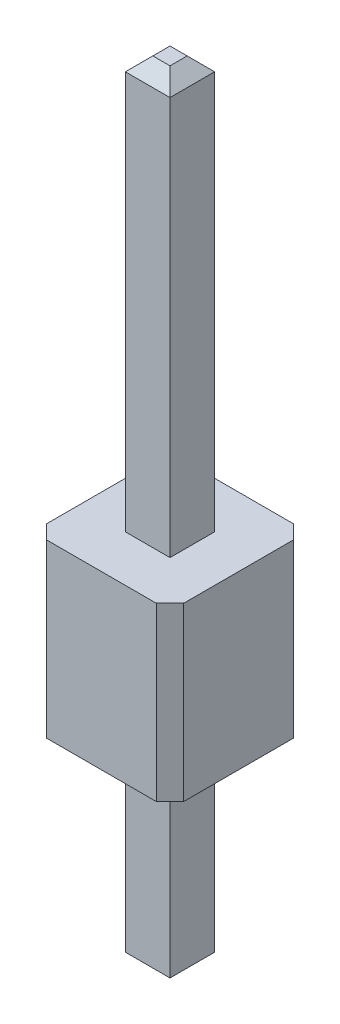
ISO-10303-21;
HEADER;
FILE_DESCRIPTION(('STEP AP214'),'2;1');
FILE_NAME('part.step','',(''),(''),'','','');
FILE_SCHEMA(('AUTOMOTIVE_DESIGN { 1 0 10303 214 1 1 1 1 }'));
ENDSEC;
DATA;
#1=APPLICATION_CONTEXT('core data for automotive mechanical design processes');
#2=APPLICATION_PROTOCOL_DEFINITION('international standard','automotive_design',2000,#1);
#3=PRODUCT_CONTEXT('',#1,'mechanical');
#4=PRODUCT('Part','Part','',(#3));
#5=PRODUCT_RELATED_PRODUCT_CATEGORY('part','',(#4));
#6=PRODUCT_DEFINITION_FORMATION('','',#4);
#7=PRODUCT_DEFINITION_CONTEXT('part definition',#1,'design');
#8=PRODUCT_DEFINITION('design','',#6,#7);
#9=PRODUCT_DEFINITION_SHAPE('','',#8);
#10=(LENGTH_UNIT() NAMED_UNIT(*) SI_UNIT(.MILLI.,.METRE.));
#11=(NAMED_UNIT(*) PLANE_ANGLE_UNIT() SI_UNIT($,.RADIAN.));
#12=(NAMED_UNIT(*) SI_UNIT($,.STERADIAN.) SOLID_ANGLE_UNIT());
#13=UNCERTAINTY_MEASURE_WITH_UNIT(LENGTH_MEASURE(1.E-05),#10,'distance_accuracy_value','');
#14=(GEOMETRIC_REPRESENTATION_CONTEXT(3) GLOBAL_UNCERTAINTY_ASSIGNED_CONTEXT((#13)) GLOBAL_UNIT_ASSIGNED_CONTEXT((#10,
#11,#12)) REPRESENTATION_CONTEXT('',''));
#15=CARTESIAN_POINT('',(0.,0.,0.));
#16=DIRECTION('',(0.,0.,1.));
#17=DIRECTION('',(1.,0.,0.));
#18=AXIS2_PLACEMENT_3D('',#15,#16,#17);
#19=CARTESIAN_POINT('',(1.,2.5,1.));
#20=DIRECTION('',(-1.,0.,0.));
#21=DIRECTION('',(0.,0.,1.));
#22=AXIS2_PLACEMENT_3D('',#19,#20,#21);
#23=PLANE('',#22);
#24=DIRECTION('',(0.,0.,-1.));
#25=VECTOR('',#24,1.);
#26=CARTESIAN_POINT('',(1.,0.,1.));
#27=LINE('',#26,#25);
#28=CARTESIAN_POINT('',(1.,0.,0.799999999999999));
#29=VERTEX_POINT('',#28);
#30=CARTESIAN_POINT('',(1.,0.,-0.799999999999999));
#31=VERTEX_POINT('',#30);
#32=EDGE_CURVE('E208',#29,#31,#27,.T.);
#33=ORIENTED_EDGE('',*,*,#32,.T.);
#34=DIRECTION('',(0.,1.,0.));
#35=VECTOR('',#34,1.);
#36=CARTESIAN_POINT('',(1.,2.5,-0.799999999999999));
#37=LINE('',#36,#35);
#38=CARTESIAN_POINT('',(1.,2.5,-0.799999999999999));
#39=VERTEX_POINT('',#38);
#40=EDGE_CURVE('E298',#31,#39,#37,.T.);
#41=ORIENTED_EDGE('',*,*,#40,.T.);
#42=DIRECTION('',(0.,0.,-1.));
#43=VECTOR('',#42,1.);
#44=CARTESIAN_POINT('',(1.,2.5,1.));
#45=LINE('',#44,#43);
#46=CARTESIAN_POINT('',(1.,2.5,0.799999999999999));
#47=VERTEX_POINT('',#46);
#48=EDGE_CURVE('E209',#47,#39,#45,.T.);
#49=ORIENTED_EDGE('',*,*,#48,.F.);
#50=DIRECTION('',(0.,-1.,0.));
#51=VECTOR('',#50,1.);
#52=CARTESIAN_POINT('',(1.,2.5,0.799999999999999));
#53=LINE('',#52,#51);
#54=EDGE_CURVE('E294',#47,#29,#53,.T.);
#55=ORIENTED_EDGE('',*,*,#54,.T.);
#56=EDGE_LOOP('',(#33,#41,#49,#55));
#57=FACE_BOUND('',#56,.T.);
#58=ADVANCED_FACE('F39',(#57),#23,.F.);
#59=CARTESIAN_POINT('',(-1.,2.5,-1.));
#60=DIRECTION('',(0.,0.,1.));
#61=DIRECTION('',(1.,0.,0.));
#62=AXIS2_PLACEMENT_3D('',#59,#60,#61);
#63=PLANE('',#62);
#64=DIRECTION('',(-1.,0.,0.));
#65=VECTOR('',#64,1.);
#66=CARTESIAN_POINT('',(-1.,0.,-1.));
#67=LINE('',#66,#65);
#68=CARTESIAN_POINT('',(0.8,0.,-1.));
#69=VERTEX_POINT('',#68);
#70=CARTESIAN_POINT('',(-0.799999999999997,0.,-1.));
#71=VERTEX_POINT('',#70);
#72=EDGE_CURVE('E230',#69,#71,#67,.T.);
#73=ORIENTED_EDGE('',*,*,#72,.T.);
#74=DIRECTION('',(0.,1.,0.));
#75=VECTOR('',#74,1.);
#76=CARTESIAN_POINT('',(-0.799999999999997,2.5,-1.));
#77=LINE('',#76,#75);
#78=CARTESIAN_POINT('',(-0.799999999999997,2.5,-1.));
#79=VERTEX_POINT('',#78);
#80=EDGE_CURVE('E279',#71,#79,#77,.T.);
#81=ORIENTED_EDGE('',*,*,#80,.T.);
#82=DIRECTION('',(-1.,0.,0.));
#83=VECTOR('',#82,1.);
#84=CARTESIAN_POINT('',(-1.,2.5,-1.));
#85=LINE('',#84,#83);
#86=CARTESIAN_POINT('',(0.8,2.5,-1.));
#87=VERTEX_POINT('',#86);
#88=EDGE_CURVE('E213',#87,#79,#85,.T.);
#89=ORIENTED_EDGE('',*,*,#88,.F.);
#90=DIRECTION('',(0.,-1.,0.));
#91=VECTOR('',#90,1.);
#92=CARTESIAN_POINT('',(0.8,2.5,-1.));
#93=LINE('',#92,#91);
#94=EDGE_CURVE('E275',#87,#69,#93,.T.);
#95=ORIENTED_EDGE('',*,*,#94,.T.);
#96=EDGE_LOOP('',(#73,#81,#89,#95));
#97=FACE_BOUND('',#96,.T.);
#98=ADVANCED_FACE('F422',(#97),#63,.F.);
#99=CARTESIAN_POINT('',(-1.,2.5,1.));
#100=DIRECTION('',(1.,0.,0.));
#101=DIRECTION('',(0.,0.,-1.));
#102=AXIS2_PLACEMENT_3D('',#99,#100,#101);
#103=PLANE('',#102);
#104=DIRECTION('',(0.,0.,1.));
#105=VECTOR('',#104,1.);
#106=CARTESIAN_POINT('',(-1.,2.5,1.));
#107=LINE('',#106,#105);
#108=CARTESIAN_POINT('',(-1.,2.5,-0.799999999999999));
#109=VERTEX_POINT('',#108);
#110=CARTESIAN_POINT('',(-1.,2.5,0.800000000000001));
#111=VERTEX_POINT('',#110);
#112=EDGE_CURVE('E218',#109,#111,#107,.T.);
#113=ORIENTED_EDGE('',*,*,#112,.F.);
#114=DIRECTION('',(0.,-1.,0.));
#115=VECTOR('',#114,1.);
#116=CARTESIAN_POINT('',(-1.,2.5,-0.799999999999999));
#117=LINE('',#116,#115);
#118=CARTESIAN_POINT('',(-1.,0.,-0.799999999999999));
#119=VERTEX_POINT('',#118);
#120=EDGE_CURVE('E259',#109,#119,#117,.T.);
#121=ORIENTED_EDGE('',*,*,#120,.T.);
#122=DIRECTION('',(0.,0.,1.));
#123=VECTOR('',#122,1.);
#124=CARTESIAN_POINT('',(-1.,0.,1.));
#125=LINE('',#124,#123);
#126=CARTESIAN_POINT('',(-1.,0.,0.800000000000001));
#127=VERTEX_POINT('',#126);
#128=EDGE_CURVE('E234',#119,#127,#125,.T.);
#129=ORIENTED_EDGE('',*,*,#128,.T.);
#130=DIRECTION('',(0.,1.,0.));
#131=VECTOR('',#130,1.);
#132=CARTESIAN_POINT('',(-1.,2.5,0.800000000000001));
#133=LINE('',#132,#131);
#134=EDGE_CURVE('E256',#127,#111,#133,.T.);
#135=ORIENTED_EDGE('',*,*,#134,.T.);
#136=EDGE_LOOP('',(#113,#121,#129,#135));
#137=FACE_BOUND('',#136,.T.);
#138=ADVANCED_FACE('F428',(#137),#103,.F.);
#139=CARTESIAN_POINT('',(-1.,2.5,1.));
#140=DIRECTION('',(0.,0.,-1.));
#141=DIRECTION('',(-1.,0.,0.));
#142=AXIS2_PLACEMENT_3D('',#139,#140,#141);
#143=PLANE('',#142);
#144=DIRECTION('',(1.,0.,0.));
#145=VECTOR('',#144,1.);
#146=CARTESIAN_POINT('',(-1.,2.5,1.));
#147=LINE('',#146,#145);
#148=CARTESIAN_POINT('',(-0.800000000000001,2.5,1.));
#149=VERTEX_POINT('',#148);
#150=CARTESIAN_POINT('',(0.799999999999998,2.5,1.));
#151=VERTEX_POINT('',#150);
#152=EDGE_CURVE('E222',#149,#151,#147,.T.);
#153=ORIENTED_EDGE('',*,*,#152,.F.);
#154=DIRECTION('',(0.,-1.,0.));
#155=VECTOR('',#154,1.);
#156=CARTESIAN_POINT('',(-0.800000000000001,2.5,1.));
#157=LINE('',#156,#155);
#158=CARTESIAN_POINT('',(-0.800000000000001,0.,1.));
#159=VERTEX_POINT('',#158);
#160=EDGE_CURVE('E304',#149,#159,#157,.T.);
#161=ORIENTED_EDGE('',*,*,#160,.T.);
#162=DIRECTION('',(1.,0.,0.));
#163=VECTOR('',#162,1.);
#164=CARTESIAN_POINT('',(-1.,0.,1.));
#165=LINE('',#164,#163);
#166=CARTESIAN_POINT('',(0.799999999999998,0.,1.));
#167=VERTEX_POINT('',#166);
#168=EDGE_CURVE('E214',#159,#167,#165,.T.);
#169=ORIENTED_EDGE('',*,*,#168,.T.);
#170=DIRECTION('',(0.,1.,0.));
#171=VECTOR('',#170,1.);
#172=CARTESIAN_POINT('',(0.799999999999998,2.5,1.));
#173=LINE('',#172,#171);
#174=EDGE_CURVE('E301',#167,#151,#173,.T.);
#175=ORIENTED_EDGE('',*,*,#174,.T.);
#176=EDGE_LOOP('',(#153,#161,#169,#175));
#177=FACE_BOUND('',#176,.T.);
#178=ADVANCED_FACE('F525',(#177),#143,.F.);
#179=CARTESIAN_POINT('',(0.,2.5,0.));
#180=DIRECTION('',(0.,-1.,0.));
#181=DIRECTION('',(0.,0.,-1.));
#182=AXIS2_PLACEMENT_3D('',#179,#180,#181);
#183=PLANE('',#182);
#184=DIRECTION('',(1.,0.,0.));
#185=VECTOR('',#184,1.);
#186=CARTESIAN_POINT('',(0.,2.5,-0.325));
#187=LINE('',#186,#185);
#188=CARTESIAN_POINT('',(-0.325,2.5,-0.325));
#189=VERTEX_POINT('',#188);
#190=CARTESIAN_POINT('',(0.325,2.5,-0.325));
#191=VERTEX_POINT('',#190);
#192=EDGE_CURVE('E177',#189,#191,#187,.T.);
#193=ORIENTED_EDGE('',*,*,#192,.T.);
#194=DIRECTION('',(0.,0.,1.));
#195=VECTOR('',#194,1.);
#196=CARTESIAN_POINT('',(0.325,2.5,0.));
#197=LINE('',#196,#195);
#198=CARTESIAN_POINT('',(0.325,2.5,0.325));
#199=VERTEX_POINT('',#198);
#200=EDGE_CURVE('E202',#191,#199,#197,.T.);
#201=ORIENTED_EDGE('',*,*,#200,.T.);
#202=DIRECTION('',(-1.,0.,0.));
#203=VECTOR('',#202,1.);
#204=CARTESIAN_POINT('',(0.,2.5,0.325));
#205=LINE('',#204,#203);
#206=CARTESIAN_POINT('',(-0.325,2.5,0.325));
#207=VERTEX_POINT('',#206);
#208=EDGE_CURVE('E198',#199,#207,#205,.T.);
#209=ORIENTED_EDGE('',*,*,#208,.T.);
#210=DIRECTION('',(0.,0.,-1.));
#211=VECTOR('',#210,1.);
#212=CARTESIAN_POINT('',(-0.325,2.5,0.));
#213=LINE('',#212,#211);
#214=EDGE_CURVE('E186',#207,#189,#213,.T.);
#215=ORIENTED_EDGE('',*,*,#214,.T.);
#216=EDGE_LOOP('',(#193,#201,#209,#215));
#217=FACE_BOUND('',#216,.T.);
#218=ORIENTED_EDGE('',*,*,#88,.T.);
#219=DIRECTION('',(0.707106781186551,0.,-0.707106781186544));
#220=VECTOR('',#219,1.);
#221=CARTESIAN_POINT('',(-1.,2.5,-0.799999999999999));
#222=LINE('',#221,#220);
#223=EDGE_CURVE('E291',#79,#109,#222,.F.);
#224=ORIENTED_EDGE('',*,*,#223,.T.);
#225=ORIENTED_EDGE('',*,*,#112,.T.);
#226=DIRECTION('',(-0.707106781186548,0.,-0.707106781186548));
#227=VECTOR('',#226,1.);
#228=CARTESIAN_POINT('',(-0.800000000000001,2.5,1.));
#229=LINE('',#228,#227);
#230=EDGE_CURVE('E285',#111,#149,#229,.F.);
#231=ORIENTED_EDGE('',*,*,#230,.T.);
#232=ORIENTED_EDGE('',*,*,#152,.T.);
#233=DIRECTION('',(-0.707106781186551,0.,0.707106781186544));
#234=VECTOR('',#233,1.);
#235=CARTESIAN_POINT('',(1.,2.5,0.799999999999999));
#236=LINE('',#235,#234);
#237=EDGE_CURVE('E282',#151,#47,#236,.F.);
#238=ORIENTED_EDGE('',*,*,#237,.T.);
#239=ORIENTED_EDGE('',*,*,#48,.T.);
#240=DIRECTION('',(0.707106781186548,0.,0.707106781186548));
#241=VECTOR('',#240,1.);
#242=CARTESIAN_POINT('',(0.8,2.5,-1.));
#243=LINE('',#242,#241);
#244=EDGE_CURVE('E288',#39,#87,#243,.F.);
#245=ORIENTED_EDGE('',*,*,#244,.T.);
#246=EDGE_LOOP('',(#218,#224,#225,#231,#232,#238,#239,#245));
#247=FACE_BOUND('',#246,.T.);
#248=ADVANCED_FACE('F196',(#217,#247),#183,.F.);
#249=CARTESIAN_POINT('',(0.,0.,0.));
#250=DIRECTION('',(0.,-1.,0.));
#251=DIRECTION('',(0.,0.,-1.));
#252=AXIS2_PLACEMENT_3D('',#249,#250,#251);
#253=PLANE('',#252);
#254=DIRECTION('',(0.,0.,1.));
#255=VECTOR('',#254,1.);
#256=CARTESIAN_POINT('',(0.325,0.,0.));
#257=LINE('',#256,#255);
#258=CARTESIAN_POINT('',(0.325,0.,-0.325));
#259=VERTEX_POINT('',#258);
#260=CARTESIAN_POINT('',(0.325,0.,0.325));
#261=VERTEX_POINT('',#260);
#262=EDGE_CURVE('E252',#259,#261,#257,.T.);
#263=ORIENTED_EDGE('',*,*,#262,.F.);
#264=DIRECTION('',(1.,0.,0.));
#265=VECTOR('',#264,1.);
#266=CARTESIAN_POINT('',(0.,0.,-0.325));
#267=LINE('',#266,#265);
#268=CARTESIAN_POINT('',(-0.325,0.,-0.325));
#269=VERTEX_POINT('',#268);
#270=EDGE_CURVE('E226',#269,#259,#267,.T.);
#271=ORIENTED_EDGE('',*,*,#270,.F.);
#272=DIRECTION('',(0.,0.,-1.));
#273=VECTOR('',#272,1.);
#274=CARTESIAN_POINT('',(-0.325,0.,0.));
#275=LINE('',#274,#273);
#276=CARTESIAN_POINT('',(-0.325,0.,0.325));
#277=VERTEX_POINT('',#276);
#278=EDGE_CURVE('E244',#277,#269,#275,.T.);
#279=ORIENTED_EDGE('',*,*,#278,.F.);
#280=DIRECTION('',(-1.,0.,0.));
#281=VECTOR('',#280,1.);
#282=CARTESIAN_POINT('',(0.,0.,0.325));
#283=LINE('',#282,#281);
#284=EDGE_CURVE('E248',#261,#277,#283,.T.);
#285=ORIENTED_EDGE('',*,*,#284,.F.);
#286=EDGE_LOOP('',(#263,#271,#279,#285));
#287=FACE_BOUND('',#286,.T.);
#288=ORIENTED_EDGE('',*,*,#128,.F.);
#289=DIRECTION('',(-0.707106781186551,0.,0.707106781186544));
#290=VECTOR('',#289,1.);
#291=CARTESIAN_POINT('',(-0.899999999999995,0.,-0.900000000000003));
#292=LINE('',#291,#290);
#293=EDGE_CURVE('E272',#119,#71,#292,.F.);
#294=ORIENTED_EDGE('',*,*,#293,.T.);
#295=ORIENTED_EDGE('',*,*,#72,.F.);
#296=DIRECTION('',(-0.707106781186548,0.,-0.707106781186548));
#297=VECTOR('',#296,1.);
#298=CARTESIAN_POINT('',(0.9,0.,-0.9));
#299=LINE('',#298,#297);
#300=EDGE_CURVE('E269',#69,#31,#299,.F.);
#301=ORIENTED_EDGE('',*,*,#300,.T.);
#302=ORIENTED_EDGE('',*,*,#32,.F.);
#303=DIRECTION('',(0.707106781186551,0.,-0.707106781186544));
#304=VECTOR('',#303,1.);
#305=CARTESIAN_POINT('',(0.899999999999996,0.,0.900000000000003));
#306=LINE('',#305,#304);
#307=EDGE_CURVE('E263',#29,#167,#306,.F.);
#308=ORIENTED_EDGE('',*,*,#307,.T.);
#309=ORIENTED_EDGE('',*,*,#168,.F.);
#310=DIRECTION('',(0.707106781186548,0.,0.707106781186548));
#311=VECTOR('',#310,1.);
#312=CARTESIAN_POINT('',(-0.9,0.,0.9));
#313=LINE('',#312,#311);
#314=EDGE_CURVE('E266',#159,#127,#313,.F.);
#315=ORIENTED_EDGE('',*,*,#314,.T.);
#316=EDGE_LOOP('',(#288,#294,#295,#301,#302,#308,#309,#315));
#317=FACE_BOUND('',#316,.T.);
#318=ADVANCED_FACE('F508',(#287,#317),#253,.T.);
#319=CARTESIAN_POINT('',(0.,-3.,0.));
#320=DIRECTION('',(0.,-1.,0.));
#321=DIRECTION('',(0.,0.,-1.));
#322=AXIS2_PLACEMENT_3D('',#319,#320,#321);
#323=PLANE('',#322);
#324=DIRECTION('',(0.,0.,1.));
#325=VECTOR('',#324,1.);
#326=CARTESIAN_POINT('',(0.125000000000001,-3.,0.));
#327=LINE('',#326,#325);
#328=CARTESIAN_POINT('',(0.125000000000001,-3.,-0.125000000000001));
#329=VERTEX_POINT('',#328);
#330=CARTESIAN_POINT('',(0.125000000000001,-3.,0.125000000000001));
#331=VERTEX_POINT('',#330);
#332=EDGE_CURVE('E312',#329,#331,#327,.T.);
#333=ORIENTED_EDGE('',*,*,#332,.T.);
#334=DIRECTION('',(-1.,0.,0.));
#335=VECTOR('',#334,1.);
#336=CARTESIAN_POINT('',(0.,-3.,0.125000000000001));
#337=LINE('',#336,#335);
#338=CARTESIAN_POINT('',(-0.125000000000001,-3.,0.125000000000001));
#339=VERTEX_POINT('',#338);
#340=EDGE_CURVE('E321',#331,#339,#337,.T.);
#341=ORIENTED_EDGE('',*,*,#340,.T.);
#342=DIRECTION('',(0.,0.,-1.));
#343=VECTOR('',#342,1.);
#344=CARTESIAN_POINT('',(-0.125000000000001,-3.,0.));
#345=LINE('',#344,#343);
#346=CARTESIAN_POINT('',(-0.125000000000001,-3.,-0.125000000000001));
#347=VERTEX_POINT('',#346);
#348=EDGE_CURVE('E318',#339,#347,#345,.T.);
#349=ORIENTED_EDGE('',*,*,#348,.T.);
#350=DIRECTION('',(1.,0.,0.));
#351=VECTOR('',#350,1.);
#352=CARTESIAN_POINT('',(0.,-3.,-0.125000000000001));
#353=LINE('',#352,#351);
#354=EDGE_CURVE('E315',#347,#329,#353,.T.);
#355=ORIENTED_EDGE('',*,*,#354,.T.);
#356=EDGE_LOOP('',(#333,#341,#349,#355));
#357=FACE_BOUND('',#356,.T.);
#358=ADVANCED_FACE('F513',(#357),#323,.T.);
#359=CARTESIAN_POINT('',(-0.325,-3.,-0.325));
#360=DIRECTION('',(0.,0.,-1.));
#361=DIRECTION('',(-1.,0.,0.));
#362=AXIS2_PLACEMENT_3D('',#359,#360,#361);
#363=PLANE('',#362);
#364=DIRECTION('',(0.,1.,0.));
#365=VECTOR('',#364,1.);
#366=CARTESIAN_POINT('',(0.325,-3.,-0.325));
#367=LINE('',#366,#365);
#368=CARTESIAN_POINT('',(0.325,-2.8,-0.325));
#369=VERTEX_POINT('',#368);
#370=EDGE_CURVE('E193',#369,#259,#367,.T.);
#371=ORIENTED_EDGE('',*,*,#370,.F.);
#372=DIRECTION('',(-1.,0.,0.));
#373=VECTOR('',#372,1.);
#374=CARTESIAN_POINT('',(-0.325,-2.8,-0.325));
#375=LINE('',#374,#373);
#376=CARTESIAN_POINT('',(-0.325,-2.8,-0.325));
#377=VERTEX_POINT('',#376);
#378=EDGE_CURVE('E328',#369,#377,#375,.T.);
#379=ORIENTED_EDGE('',*,*,#378,.T.);
#380=DIRECTION('',(0.,1.,0.));
#381=VECTOR('',#380,1.);
#382=CARTESIAN_POINT('',(-0.325,-3.,-0.325));
#383=LINE('',#382,#381);
#384=EDGE_CURVE('E192',#377,#269,#383,.T.);
#385=ORIENTED_EDGE('',*,*,#384,.T.);
#386=ORIENTED_EDGE('',*,*,#270,.T.);
#387=EDGE_LOOP('',(#371,#379,#385,#386));
#388=FACE_BOUND('',#387,.T.);
#389=ADVANCED_FACE('F419',(#388),#363,.T.);
#390=CARTESIAN_POINT('',(-0.325,-3.,0.325));
#391=DIRECTION('',(-1.,0.,0.));
#392=DIRECTION('',(0.,0.,1.));
#393=AXIS2_PLACEMENT_3D('',#390,#391,#392);
#394=PLANE('',#393);
#395=ORIENTED_EDGE('',*,*,#384,.F.);
#396=DIRECTION('',(0.,0.,1.));
#397=VECTOR('',#396,1.);
#398=CARTESIAN_POINT('',(-0.325,-2.8,0.325));
#399=LINE('',#398,#397);
#400=CARTESIAN_POINT('',(-0.325,-2.8,0.325));
#401=VERTEX_POINT('',#400);
#402=EDGE_CURVE('E325',#377,#401,#399,.T.);
#403=ORIENTED_EDGE('',*,*,#402,.T.);
#404=DIRECTION('',(0.,1.,0.));
#405=VECTOR('',#404,1.);
#406=CARTESIAN_POINT('',(-0.325,-3.,0.325));
#407=LINE('',#406,#405);
#408=EDGE_CURVE('E401',#401,#277,#407,.T.);
#409=ORIENTED_EDGE('',*,*,#408,.T.);
#410=ORIENTED_EDGE('',*,*,#278,.T.);
#411=EDGE_LOOP('',(#395,#403,#409,#410));
#412=FACE_BOUND('',#411,.T.);
#413=ADVANCED_FACE('F564',(#412),#394,.T.);
#414=CARTESIAN_POINT('',(-0.325,-3.,0.325));
#415=DIRECTION('',(0.,0.,1.));
#416=DIRECTION('',(1.,0.,0.));
#417=AXIS2_PLACEMENT_3D('',#414,#415,#416);
#418=PLANE('',#417);
#419=ORIENTED_EDGE('',*,*,#408,.F.);
#420=DIRECTION('',(1.,0.,0.));
#421=VECTOR('',#420,1.);
#422=CARTESIAN_POINT('',(-0.325,-2.8,0.325));
#423=LINE('',#422,#421);
#424=CARTESIAN_POINT('',(0.325,-2.8,0.325));
#425=VERTEX_POINT('',#424);
#426=EDGE_CURVE('E308',#401,#425,#423,.T.);
#427=ORIENTED_EDGE('',*,*,#426,.T.);
#428=DIRECTION('',(0.,1.,0.));
#429=VECTOR('',#428,1.);
#430=CARTESIAN_POINT('',(0.325,-3.,0.325));
#431=LINE('',#430,#429);
#432=EDGE_CURVE('E187',#425,#261,#431,.T.);
#433=ORIENTED_EDGE('',*,*,#432,.T.);
#434=ORIENTED_EDGE('',*,*,#284,.T.);
#435=EDGE_LOOP('',(#419,#427,#433,#434));
#436=FACE_BOUND('',#435,.T.);
#437=ADVANCED_FACE('F560',(#436),#418,.T.);
#438=CARTESIAN_POINT('',(0.325,-3.,0.325));
#439=DIRECTION('',(1.,0.,0.));
#440=DIRECTION('',(0.,0.,-1.));
#441=AXIS2_PLACEMENT_3D('',#438,#439,#440);
#442=PLANE('',#441);
#443=ORIENTED_EDGE('',*,*,#432,.F.);
#444=DIRECTION('',(0.,0.,-1.));
#445=VECTOR('',#444,1.);
#446=CARTESIAN_POINT('',(0.325,-2.8,0.325));
#447=LINE('',#446,#445);
#448=EDGE_CURVE('E331',#425,#369,#447,.T.);
#449=ORIENTED_EDGE('',*,*,#448,.T.);
#450=ORIENTED_EDGE('',*,*,#370,.T.);
#451=ORIENTED_EDGE('',*,*,#262,.T.);
#452=EDGE_LOOP('',(#443,#449,#450,#451));
#453=FACE_BOUND('',#452,.T.);
#454=ADVANCED_FACE('F558',(#453),#442,.T.);
#455=CARTESIAN_POINT('',(0.325,8.3,-0.325));
#456=VERTEX_POINT('',#455);
#457=EDGE_CURVE('E180',#191,#456,#367,.T.);
#458=ORIENTED_EDGE('',*,*,#457,.T.);
#459=DIRECTION('',(0.,0.,1.));
#460=VECTOR('',#459,1.);
#461=CARTESIAN_POINT('',(0.325,8.3,0.325));
#462=LINE('',#461,#460);
#463=CARTESIAN_POINT('',(0.325,8.3,0.325));
#464=VERTEX_POINT('',#463);
#465=EDGE_CURVE('E11',#456,#464,#462,.T.);
#466=ORIENTED_EDGE('',*,*,#465,.T.);
#467=EDGE_CURVE('E396',#199,#464,#431,.T.);
#468=ORIENTED_EDGE('',*,*,#467,.F.);
#469=ORIENTED_EDGE('',*,*,#200,.F.);
#470=EDGE_LOOP('',(#458,#466,#468,#469));
#471=FACE_BOUND('',#470,.T.);
#472=ADVANCED_FACE('F395',(#471),#442,.T.);
#473=ORIENTED_EDGE('',*,*,#467,.T.);
#474=DIRECTION('',(-1.,0.,0.));
#475=VECTOR('',#474,1.);
#476=CARTESIAN_POINT('',(-0.325,8.3,0.325));
#477=LINE('',#476,#475);
#478=CARTESIAN_POINT('',(-0.325,8.3,0.325));
#479=VERTEX_POINT('',#478);
#480=EDGE_CURVE('E347',#464,#479,#477,.T.);
#481=ORIENTED_EDGE('',*,*,#480,.T.);
#482=EDGE_CURVE('E590',#207,#479,#407,.T.);
#483=ORIENTED_EDGE('',*,*,#482,.F.);
#484=ORIENTED_EDGE('',*,*,#208,.F.);
#485=EDGE_LOOP('',(#473,#481,#483,#484));
#486=FACE_BOUND('',#485,.T.);
#487=ADVANCED_FACE('F399',(#486),#418,.T.);
#488=ORIENTED_EDGE('',*,*,#482,.T.);
#489=DIRECTION('',(0.,0.,-1.));
#490=VECTOR('',#489,1.);
#491=CARTESIAN_POINT('',(-0.325,8.3,-0.325));
#492=LINE('',#491,#490);
#493=CARTESIAN_POINT('',(-0.325,8.3,-0.325));
#494=VERTEX_POINT('',#493);
#495=EDGE_CURVE('E64',#479,#494,#492,.T.);
#496=ORIENTED_EDGE('',*,*,#495,.T.);
#497=EDGE_CURVE('E179',#189,#494,#383,.T.);
#498=ORIENTED_EDGE('',*,*,#497,.F.);
#499=ORIENTED_EDGE('',*,*,#214,.F.);
#500=EDGE_LOOP('',(#488,#496,#498,#499));
#501=FACE_BOUND('',#500,.T.);
#502=ADVANCED_FACE('F189',(#501),#394,.T.);
#503=ORIENTED_EDGE('',*,*,#497,.T.);
#504=DIRECTION('',(1.,0.,0.));
#505=VECTOR('',#504,1.);
#506=CARTESIAN_POINT('',(0.325,8.3,-0.325));
#507=LINE('',#506,#505);
#508=EDGE_CURVE('E49',#494,#456,#507,.T.);
#509=ORIENTED_EDGE('',*,*,#508,.T.);
#510=ORIENTED_EDGE('',*,*,#457,.F.);
#511=ORIENTED_EDGE('',*,*,#192,.F.);
#512=EDGE_LOOP('',(#503,#509,#510,#511));
#513=FACE_BOUND('',#512,.T.);
#514=ADVANCED_FACE('F178',(#513),#363,.T.);
#515=CARTESIAN_POINT('',(0.,8.5,0.));
#516=DIRECTION('',(0.,-1.,0.));
#517=DIRECTION('',(0.,0.,-1.));
#518=AXIS2_PLACEMENT_3D('',#515,#516,#517);
#519=PLANE('',#518);
#520=DIRECTION('',(0.,0.,1.));
#521=VECTOR('',#520,1.);
#522=CARTESIAN_POINT('',(-0.124999999999998,8.5,0.325));
#523=LINE('',#522,#521);
#524=CARTESIAN_POINT('',(-0.124999999999998,8.5,-0.124999999999998));
#525=VERTEX_POINT('',#524);
#526=CARTESIAN_POINT('',(-0.124999999999998,8.5,0.124999999999998));
#527=VERTEX_POINT('',#526);
#528=EDGE_CURVE('E340',#525,#527,#523,.T.);
#529=ORIENTED_EDGE('',*,*,#528,.T.);
#530=DIRECTION('',(1.,0.,0.));
#531=VECTOR('',#530,1.);
#532=CARTESIAN_POINT('',(0.325,8.5,0.124999999999998));
#533=LINE('',#532,#531);
#534=CARTESIAN_POINT('',(0.124999999999998,8.5,0.124999999999998));
#535=VERTEX_POINT('',#534);
#536=EDGE_CURVE('E343',#527,#535,#533,.T.);
#537=ORIENTED_EDGE('',*,*,#536,.T.);
#538=DIRECTION('',(0.,0.,-1.));
#539=VECTOR('',#538,1.);
#540=CARTESIAN_POINT('',(0.124999999999998,8.5,-0.325));
#541=LINE('',#540,#539);
#542=CARTESIAN_POINT('',(0.124999999999998,8.5,-0.124999999999998));
#543=VERTEX_POINT('',#542);
#544=EDGE_CURVE('E334',#535,#543,#541,.T.);
#545=ORIENTED_EDGE('',*,*,#544,.T.);
#546=DIRECTION('',(-1.,0.,0.));
#547=VECTOR('',#546,1.);
#548=CARTESIAN_POINT('',(-0.325,8.5,-0.124999999999998));
#549=LINE('',#548,#547);
#550=EDGE_CURVE('E337',#543,#525,#549,.T.);
#551=ORIENTED_EDGE('',*,*,#550,.T.);
#552=EDGE_LOOP('',(#529,#537,#545,#551));
#553=FACE_BOUND('',#552,.T.);
#554=ADVANCED_FACE('F407',(#553),#519,.F.);
#555=CARTESIAN_POINT('',(-1.,2.5,-0.799999999999999));
#556=DIRECTION('',(0.707106781186544,0.,0.707106781186551));
#557=DIRECTION('',(0.,-1.,0.));
#558=AXIS2_PLACEMENT_3D('',#555,#556,#557);
#559=PLANE('',#558);
#560=ORIENTED_EDGE('',*,*,#223,.F.);
#561=ORIENTED_EDGE('',*,*,#80,.F.);
#562=ORIENTED_EDGE('',*,*,#293,.F.);
#563=ORIENTED_EDGE('',*,*,#120,.F.);
#564=EDGE_LOOP('',(#560,#561,#562,#563));
#565=FACE_BOUND('',#564,.T.);
#566=ADVANCED_FACE('F409',(#565),#559,.F.);
#567=CARTESIAN_POINT('',(0.8,2.5,-1.));
#568=DIRECTION('',(-0.707106781186547,0.,0.707106781186547));
#569=DIRECTION('',(0.,-1.,0.));
#570=AXIS2_PLACEMENT_3D('',#567,#568,#569);
#571=PLANE('',#570);
#572=ORIENTED_EDGE('',*,*,#244,.F.);
#573=ORIENTED_EDGE('',*,*,#40,.F.);
#574=ORIENTED_EDGE('',*,*,#300,.F.);
#575=ORIENTED_EDGE('',*,*,#94,.F.);
#576=EDGE_LOOP('',(#572,#573,#574,#575));
#577=FACE_BOUND('',#576,.T.);
#578=ADVANCED_FACE('F415',(#577),#571,.F.);
#579=CARTESIAN_POINT('',(-0.800000000000001,2.5,1.));
#580=DIRECTION('',(0.707106781186548,0.,-0.707106781186548));
#581=DIRECTION('',(0.,-1.,0.));
#582=AXIS2_PLACEMENT_3D('',#579,#580,#581);
#583=PLANE('',#582);
#584=ORIENTED_EDGE('',*,*,#230,.F.);
#585=ORIENTED_EDGE('',*,*,#134,.F.);
#586=ORIENTED_EDGE('',*,*,#314,.F.);
#587=ORIENTED_EDGE('',*,*,#160,.F.);
#588=EDGE_LOOP('',(#584,#585,#586,#587));
#589=FACE_BOUND('',#588,.T.);
#590=ADVANCED_FACE('F435',(#589),#583,.F.);
#591=CARTESIAN_POINT('',(1.,2.5,0.799999999999999));
#592=DIRECTION('',(-0.707106781186544,0.,-0.707106781186551));
#593=DIRECTION('',(0.,-1.,0.));
#594=AXIS2_PLACEMENT_3D('',#591,#592,#593);
#595=PLANE('',#594);
#596=ORIENTED_EDGE('',*,*,#237,.F.);
#597=ORIENTED_EDGE('',*,*,#174,.F.);
#598=ORIENTED_EDGE('',*,*,#307,.F.);
#599=ORIENTED_EDGE('',*,*,#54,.F.);
#600=EDGE_LOOP('',(#596,#597,#598,#599));
#601=FACE_BOUND('',#600,.T.);
#602=ADVANCED_FACE('F439',(#601),#595,.F.);
#603=CARTESIAN_POINT('',(-0.325,-2.8,-0.325));
#604=DIRECTION('',(0.,0.707106781186551,0.707106781186544));
#605=DIRECTION('',(-1.,0.,0.));
#606=AXIS2_PLACEMENT_3D('',#603,#604,#605);
#607=PLANE('',#606);
#608=DIRECTION('',(0.577350269189627,0.577350269189622,-0.577350269189627));
#609=VECTOR('',#608,1.);
#610=CARTESIAN_POINT('',(0.108333333333332,-3.01666666666667,-0.108333333333332));
#611=LINE('',#610,#609);
#612=EDGE_CURVE('E361',#329,#369,#611,.T.);
#613=ORIENTED_EDGE('',*,*,#612,.F.);
#614=ORIENTED_EDGE('',*,*,#354,.F.);
#615=DIRECTION('',(-0.577350269189627,0.577350269189622,-0.577350269189627));
#616=VECTOR('',#615,1.);
#617=CARTESIAN_POINT('',(-0.325,-2.8,-0.325));
#618=LINE('',#617,#616);
#619=EDGE_CURVE('E365',#377,#347,#618,.F.);
#620=ORIENTED_EDGE('',*,*,#619,.F.);
#621=ORIENTED_EDGE('',*,*,#378,.F.);
#622=EDGE_LOOP('',(#613,#614,#620,#621));
#623=FACE_BOUND('',#622,.T.);
#624=ADVANCED_FACE('F443',(#623),#607,.F.);
#625=CARTESIAN_POINT('',(-0.325,-2.8,0.325));
#626=DIRECTION('',(0.707106781186544,0.707106781186551,0.));
#627=DIRECTION('',(0.,0.,1.));
#628=AXIS2_PLACEMENT_3D('',#625,#626,#627);
#629=PLANE('',#628);
#630=ORIENTED_EDGE('',*,*,#619,.T.);
#631=ORIENTED_EDGE('',*,*,#348,.F.);
#632=DIRECTION('',(-0.577350269189627,0.577350269189622,0.577350269189627));
#633=VECTOR('',#632,1.);
#634=CARTESIAN_POINT('',(-0.325,-2.8,0.325));
#635=LINE('',#634,#633);
#636=EDGE_CURVE('E358',#401,#339,#635,.F.);
#637=ORIENTED_EDGE('',*,*,#636,.F.);
#638=ORIENTED_EDGE('',*,*,#402,.F.);
#639=EDGE_LOOP('',(#630,#631,#637,#638));
#640=FACE_BOUND('',#639,.T.);
#641=ADVANCED_FACE('F452',(#640),#629,.F.);
#642=CARTESIAN_POINT('',(0.325,-2.8,0.325));
#643=DIRECTION('',(-0.707106781186544,0.707106781186551,0.));
#644=DIRECTION('',(0.,0.,-1.));
#645=AXIS2_PLACEMENT_3D('',#642,#643,#644);
#646=PLANE('',#645);
#647=ORIENTED_EDGE('',*,*,#612,.T.);
#648=ORIENTED_EDGE('',*,*,#448,.F.);
#649=DIRECTION('',(-0.577350269189627,-0.577350269189622,-0.577350269189627));
#650=VECTOR('',#649,1.);
#651=CARTESIAN_POINT('',(0.325,-2.8,0.325));
#652=LINE('',#651,#650);
#653=EDGE_CURVE('E355',#331,#425,#652,.F.);
#654=ORIENTED_EDGE('',*,*,#653,.F.);
#655=ORIENTED_EDGE('',*,*,#332,.F.);
#656=EDGE_LOOP('',(#647,#648,#654,#655));
#657=FACE_BOUND('',#656,.T.);
#658=ADVANCED_FACE('F448',(#657),#646,.F.);
#659=CARTESIAN_POINT('',(-0.325,-2.8,0.325));
#660=DIRECTION('',(0.,0.707106781186551,-0.707106781186544));
#661=DIRECTION('',(1.,0.,0.));
#662=AXIS2_PLACEMENT_3D('',#659,#660,#661);
#663=PLANE('',#662);
#664=ORIENTED_EDGE('',*,*,#636,.T.);
#665=ORIENTED_EDGE('',*,*,#340,.F.);
#666=ORIENTED_EDGE('',*,*,#653,.T.);
#667=ORIENTED_EDGE('',*,*,#426,.F.);
#668=EDGE_LOOP('',(#664,#665,#666,#667));
#669=FACE_BOUND('',#668,.T.);
#670=ADVANCED_FACE('F445',(#669),#663,.F.);
#671=CARTESIAN_POINT('',(0.,8.5,-0.124999999999998));
#672=DIRECTION('',(0.,0.707106781186547,-0.707106781186547));
#673=DIRECTION('',(1.,0.,0.));
#674=AXIS2_PLACEMENT_3D('',#671,#672,#673);
#675=PLANE('',#674);
#676=DIRECTION('',(-0.577350269189626,0.577350269189626,0.577350269189626));
#677=VECTOR('',#676,1.);
#678=CARTESIAN_POINT('',(0.0833333333333319,8.54166666666667,-0.0833333333333319));
#679=LINE('',#678,#677);
#680=EDGE_CURVE('E374',#456,#543,#679,.T.);
#681=ORIENTED_EDGE('',*,*,#680,.F.);
#682=ORIENTED_EDGE('',*,*,#508,.F.);
#683=DIRECTION('',(0.577350269189626,0.577350269189626,0.577350269189626));
#684=VECTOR('',#683,1.);
#685=CARTESIAN_POINT('',(-0.0833333333333318,8.54166666666667,-0.083333333333332));
#686=LINE('',#685,#684);
#687=EDGE_CURVE('E43',#525,#494,#686,.F.);
#688=ORIENTED_EDGE('',*,*,#687,.F.);
#689=ORIENTED_EDGE('',*,*,#550,.F.);
#690=EDGE_LOOP('',(#681,#682,#688,#689));
#691=FACE_BOUND('',#690,.T.);
#692=ADVANCED_FACE('F41',(#691),#675,.T.);
#693=CARTESIAN_POINT('',(-0.124999999999998,8.5,0.));
#694=DIRECTION('',(-0.707106781186547,0.707106781186547,0.));
#695=DIRECTION('',(0.,0.,-1.));
#696=AXIS2_PLACEMENT_3D('',#693,#694,#695);
#697=PLANE('',#696);
#698=ORIENTED_EDGE('',*,*,#687,.T.);
#699=ORIENTED_EDGE('',*,*,#495,.F.);
#700=DIRECTION('',(0.577350269189626,0.577350269189626,-0.577350269189626));
#701=VECTOR('',#700,1.);
#702=CARTESIAN_POINT('',(-0.0833333333333317,8.54166666666667,0.0833333333333318));
#703=LINE('',#702,#701);
#704=EDGE_CURVE('E372',#527,#479,#703,.F.);
#705=ORIENTED_EDGE('',*,*,#704,.F.);
#706=ORIENTED_EDGE('',*,*,#528,.F.);
#707=EDGE_LOOP('',(#698,#699,#705,#706));
#708=FACE_BOUND('',#707,.T.);
#709=ADVANCED_FACE('F386',(#708),#697,.T.);
#710=CARTESIAN_POINT('',(0.124999999999998,8.5,0.));
#711=DIRECTION('',(0.707106781186547,0.707106781186547,0.));
#712=DIRECTION('',(0.,0.,1.));
#713=AXIS2_PLACEMENT_3D('',#710,#711,#712);
#714=PLANE('',#713);
#715=ORIENTED_EDGE('',*,*,#680,.T.);
#716=ORIENTED_EDGE('',*,*,#544,.F.);
#717=DIRECTION('',(0.577350269189626,-0.577350269189626,0.577350269189626));
#718=VECTOR('',#717,1.);
#719=CARTESIAN_POINT('',(0.083333333333332,8.54166666666667,0.0833333333333318));
#720=LINE('',#719,#718);
#721=EDGE_CURVE('E369',#464,#535,#720,.F.);
#722=ORIENTED_EDGE('',*,*,#721,.F.);
#723=ORIENTED_EDGE('',*,*,#465,.F.);
#724=EDGE_LOOP('',(#715,#716,#722,#723));
#725=FACE_BOUND('',#724,.T.);
#726=ADVANCED_FACE('F391',(#725),#714,.T.);
#727=CARTESIAN_POINT('',(0.,8.5,0.124999999999998));
#728=DIRECTION('',(0.,0.707106781186547,0.707106781186547));
#729=DIRECTION('',(-1.,0.,0.));
#730=AXIS2_PLACEMENT_3D('',#727,#728,#729);
#731=PLANE('',#730);
#732=ORIENTED_EDGE('',*,*,#704,.T.);
#733=ORIENTED_EDGE('',*,*,#480,.F.);
#734=ORIENTED_EDGE('',*,*,#721,.T.);
#735=ORIENTED_EDGE('',*,*,#536,.F.);
#736=EDGE_LOOP('',(#732,#733,#734,#735));
#737=FACE_BOUND('',#736,.T.);
#738=ADVANCED_FACE('F404',(#737),#731,.T.);
#739=CLOSED_SHELL('',(#58,#98,#138,#178,#248,#318,#358,#389,#413,#437,#454,#472,#487,#502,#514,
#554,#566,#578,#590,#602,#624,#641,#658,#670,#692,#709,#726,#738));
#740=MANIFOLD_SOLID_BREP('B2',#739);
#741=ADVANCED_BREP_SHAPE_REPRESENTATION('',(#18,#740),#14);
#742=SHAPE_DEFINITION_REPRESENTATION(#9,#741);
ENDSEC;
END-ISO-10303-21;
